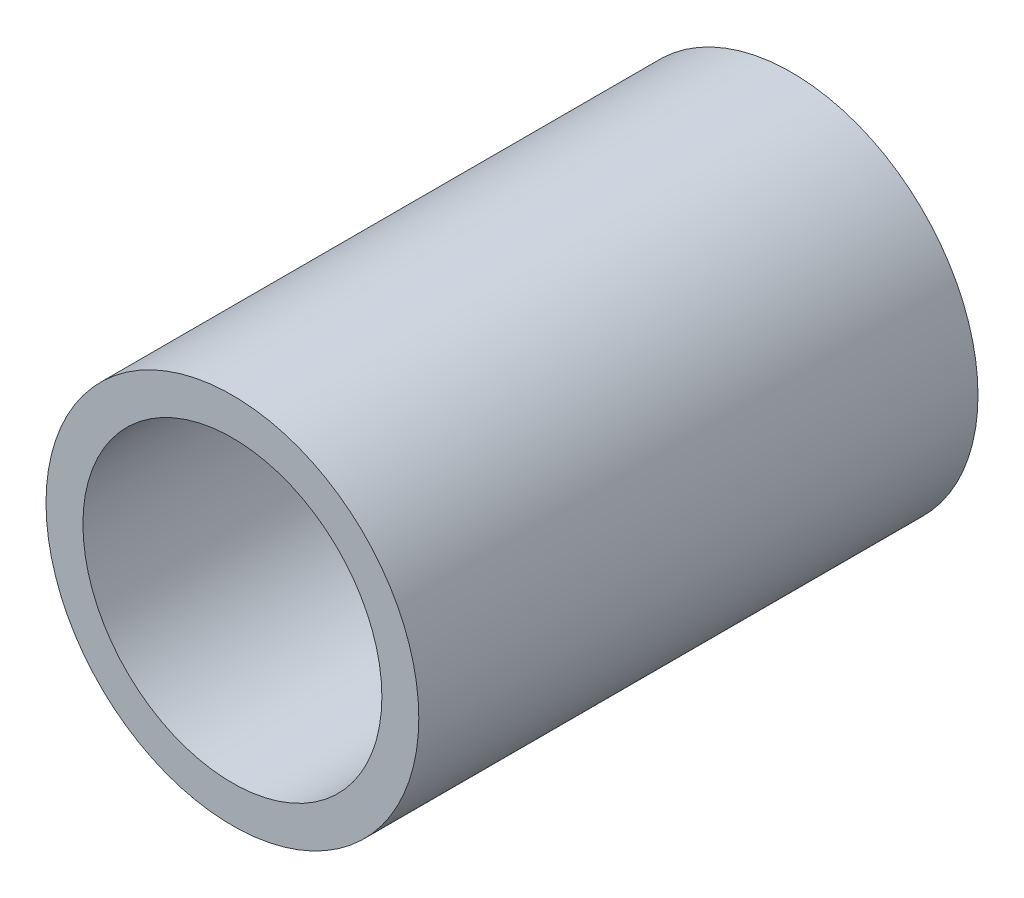
ISO-10303-21;
HEADER;
FILE_DESCRIPTION(('STEP AP214'),'2;1');
FILE_NAME('part.step','',(''),(''),'','','');
FILE_SCHEMA(('AUTOMOTIVE_DESIGN { 1 0 10303 214 1 1 1 1 }'));
ENDSEC;
DATA;
#1=APPLICATION_CONTEXT('core data for automotive mechanical design processes');
#2=APPLICATION_PROTOCOL_DEFINITION('international standard','automotive_design',2000,#1);
#3=PRODUCT_CONTEXT('',#1,'mechanical');
#4=PRODUCT('Part','Part','',(#3));
#5=PRODUCT_RELATED_PRODUCT_CATEGORY('part','',(#4));
#6=PRODUCT_DEFINITION_FORMATION('','',#4);
#7=PRODUCT_DEFINITION_CONTEXT('part definition',#1,'design');
#8=PRODUCT_DEFINITION('design','',#6,#7);
#9=PRODUCT_DEFINITION_SHAPE('','',#8);
#10=(LENGTH_UNIT() NAMED_UNIT(*) SI_UNIT(.MILLI.,.METRE.));
#11=(NAMED_UNIT(*) PLANE_ANGLE_UNIT() SI_UNIT($,.RADIAN.));
#12=(NAMED_UNIT(*) SI_UNIT($,.STERADIAN.) SOLID_ANGLE_UNIT());
#13=UNCERTAINTY_MEASURE_WITH_UNIT(LENGTH_MEASURE(1.E-05),#10,'distance_accuracy_value','');
#14=(GEOMETRIC_REPRESENTATION_CONTEXT(3) GLOBAL_UNCERTAINTY_ASSIGNED_CONTEXT((#13)) GLOBAL_UNIT_ASSIGNED_CONTEXT((#10,
#11,#12)) REPRESENTATION_CONTEXT('',''));
#15=CARTESIAN_POINT('',(0.,0.,0.));
#16=DIRECTION('',(0.,0.,1.));
#17=DIRECTION('',(1.,0.,0.));
#18=AXIS2_PLACEMENT_3D('',#15,#16,#17);
#19=CARTESIAN_POINT('',(0.,0.,15.));
#20=DIRECTION('',(0.,0.,1.));
#21=DIRECTION('',(1.,0.,0.));
#22=AXIS2_PLACEMENT_3D('',#19,#20,#21);
#23=PLANE('',#22);
#24=CARTESIAN_POINT('',(0.,0.,15.));
#25=DIRECTION('',(0.,0.,1.));
#26=DIRECTION('',(1.,0.,0.));
#27=AXIS2_PLACEMENT_3D('',#24,#25,#26);
#28=CIRCLE('',#27,5.);
#29=CARTESIAN_POINT('',(5.,0.,15.));
#30=VERTEX_POINT('',#29);
#31=EDGE_CURVE('E10',#30,#30,#28,.T.);
#32=ORIENTED_EDGE('',*,*,#31,.T.);
#33=EDGE_LOOP('',(#32));
#34=FACE_BOUND('',#33,.T.);
#35=CARTESIAN_POINT('',(0.,0.,15.));
#36=DIRECTION('',(0.,0.,1.));
#37=DIRECTION('',(1.,0.,0.));
#38=AXIS2_PLACEMENT_3D('',#35,#36,#37);
#39=CIRCLE('',#38,4.01);
#40=CARTESIAN_POINT('',(4.01,0.,15.));
#41=VERTEX_POINT('',#40);
#42=EDGE_CURVE('E50',#41,#41,#39,.T.);
#43=ORIENTED_EDGE('',*,*,#42,.F.);
#44=EDGE_LOOP('',(#43));
#45=FACE_BOUND('',#44,.T.);
#46=ADVANCED_FACE('F38',(#34,#45),#23,.T.);
#47=CARTESIAN_POINT('',(0.,0.,0.));
#48=DIRECTION('',(0.,0.,1.));
#49=DIRECTION('',(1.,0.,0.));
#50=AXIS2_PLACEMENT_3D('',#47,#48,#49);
#51=PLANE('',#50);
#52=CARTESIAN_POINT('',(0.,0.,0.));
#53=DIRECTION('',(0.,0.,1.));
#54=DIRECTION('',(1.,0.,0.));
#55=AXIS2_PLACEMENT_3D('',#52,#53,#54);
#56=CIRCLE('',#55,5.);
#57=CARTESIAN_POINT('',(5.,0.,0.));
#58=VERTEX_POINT('',#57);
#59=EDGE_CURVE('E37',#58,#58,#56,.T.);
#60=ORIENTED_EDGE('',*,*,#59,.F.);
#61=EDGE_LOOP('',(#60));
#62=FACE_BOUND('',#61,.T.);
#63=CARTESIAN_POINT('',(0.,0.,0.));
#64=DIRECTION('',(0.,0.,1.));
#65=DIRECTION('',(1.,0.,0.));
#66=AXIS2_PLACEMENT_3D('',#63,#64,#65);
#67=CIRCLE('',#66,4.01);
#68=CARTESIAN_POINT('',(4.01,0.,0.));
#69=VERTEX_POINT('',#68);
#70=EDGE_CURVE('E47',#69,#69,#67,.T.);
#71=ORIENTED_EDGE('',*,*,#70,.T.);
#72=EDGE_LOOP('',(#71));
#73=FACE_BOUND('',#72,.T.);
#74=ADVANCED_FACE('F56',(#62,#73),#51,.F.);
#75=CARTESIAN_POINT('',(0.,0.,15.));
#76=DIRECTION('',(0.,0.,-1.));
#77=DIRECTION('',(-1.,0.,0.));
#78=AXIS2_PLACEMENT_3D('',#75,#76,#77);
#79=CYLINDRICAL_SURFACE('',#78,5.);
#80=ORIENTED_EDGE('',*,*,#31,.F.);
#81=EDGE_LOOP('',(#80));
#82=FACE_BOUND('',#81,.T.);
#83=ORIENTED_EDGE('',*,*,#59,.T.);
#84=EDGE_LOOP('',(#83));
#85=FACE_BOUND('',#84,.T.);
#86=ADVANCED_FACE('F36',(#82,#85),#79,.T.);
#87=CARTESIAN_POINT('',(0.,0.,15.));
#88=DIRECTION('',(0.,0.,-1.));
#89=DIRECTION('',(-1.,0.,0.));
#90=AXIS2_PLACEMENT_3D('',#87,#88,#89);
#91=CYLINDRICAL_SURFACE('',#90,4.01);
#92=ORIENTED_EDGE('',*,*,#42,.T.);
#93=EDGE_LOOP('',(#92));
#94=FACE_BOUND('',#93,.T.);
#95=ORIENTED_EDGE('',*,*,#70,.F.);
#96=EDGE_LOOP('',(#95));
#97=FACE_BOUND('',#96,.T.);
#98=ADVANCED_FACE('F54',(#94,#97),#91,.F.);
#99=CLOSED_SHELL('',(#46,#74,#86,#98));
#100=MANIFOLD_SOLID_BREP('B2',#99);
#101=ADVANCED_BREP_SHAPE_REPRESENTATION('',(#18,#100),#14);
#102=SHAPE_DEFINITION_REPRESENTATION(#9,#101);
ENDSEC;
END-ISO-10303-21;
